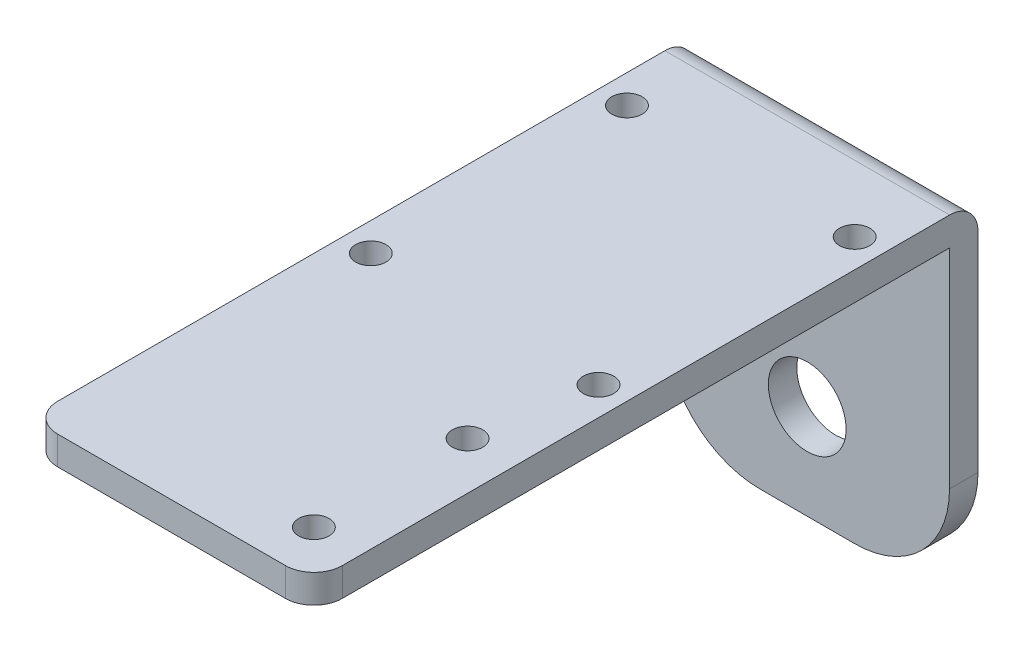
ISO-10303-21;
HEADER;
FILE_DESCRIPTION(('STEP AP214'),'2;1');
FILE_NAME('part.step','',(''),(''),'','','');
FILE_SCHEMA(('AUTOMOTIVE_DESIGN { 1 0 10303 214 1 1 1 1 }'));
ENDSEC;
DATA;
#1=APPLICATION_CONTEXT('core data for automotive mechanical design processes');
#2=APPLICATION_PROTOCOL_DEFINITION('international standard','automotive_design',2000,#1);
#3=PRODUCT_CONTEXT('',#1,'mechanical');
#4=PRODUCT('Part','Part','',(#3));
#5=PRODUCT_RELATED_PRODUCT_CATEGORY('part','',(#4));
#6=PRODUCT_DEFINITION_FORMATION('','',#4);
#7=PRODUCT_DEFINITION_CONTEXT('part definition',#1,'design');
#8=PRODUCT_DEFINITION('design','',#6,#7);
#9=PRODUCT_DEFINITION_SHAPE('','',#8);
#10=(LENGTH_UNIT() NAMED_UNIT(*) SI_UNIT(.MILLI.,.METRE.));
#11=(NAMED_UNIT(*) PLANE_ANGLE_UNIT() SI_UNIT($,.RADIAN.));
#12=(NAMED_UNIT(*) SI_UNIT($,.STERADIAN.) SOLID_ANGLE_UNIT());
#13=UNCERTAINTY_MEASURE_WITH_UNIT(LENGTH_MEASURE(1.E-05),#10,'distance_accuracy_value','');
#14=(GEOMETRIC_REPRESENTATION_CONTEXT(3) GLOBAL_UNCERTAINTY_ASSIGNED_CONTEXT((#13)) GLOBAL_UNIT_ASSIGNED_CONTEXT((#10,
#11,#12)) REPRESENTATION_CONTEXT('',''));
#15=CARTESIAN_POINT('',(0.,0.,0.));
#16=DIRECTION('',(0.,0.,1.));
#17=DIRECTION('',(1.,0.,0.));
#18=AXIS2_PLACEMENT_3D('',#15,#16,#17);
#19=CARTESIAN_POINT('',(0.,0.,0.));
#20=DIRECTION('',(0.,1.,0.));
#21=DIRECTION('',(0.,0.,1.));
#22=AXIS2_PLACEMENT_3D('',#19,#20,#21);
#23=PLANE('',#22);
#24=CARTESIAN_POINT('',(9.99999999999994,0.,13.8));
#25=DIRECTION('',(0.,1.,0.));
#26=DIRECTION('',(0.,0.,1.));
#27=AXIS2_PLACEMENT_3D('',#24,#25,#26);
#28=CIRCLE('',#27,1.6);
#29=CARTESIAN_POINT('',(9.99999999999994,0.,15.4));
#30=VERTEX_POINT('',#29);
#31=EDGE_CURVE('E152',#30,#30,#28,.T.);
#32=ORIENTED_EDGE('',*,*,#31,.T.);
#33=EDGE_LOOP('',(#32));
#34=FACE_BOUND('',#33,.T.);
#35=CARTESIAN_POINT('',(-11.9999999999997,0.,2.));
#36=DIRECTION('',(0.,1.,0.));
#37=DIRECTION('',(0.,0.,1.));
#38=AXIS2_PLACEMENT_3D('',#35,#36,#37);
#39=CIRCLE('',#38,1.6);
#40=CARTESIAN_POINT('',(-11.9999999999997,0.,3.6));
#41=VERTEX_POINT('',#40);
#42=EDGE_CURVE('E158',#41,#41,#39,.T.);
#43=ORIENTED_EDGE('',*,*,#42,.T.);
#44=EDGE_LOOP('',(#43));
#45=FACE_BOUND('',#44,.T.);
#46=CARTESIAN_POINT('',(12.0000000000003,0.,2.));
#47=DIRECTION('',(0.,1.,0.));
#48=DIRECTION('',(0.,0.,1.));
#49=AXIS2_PLACEMENT_3D('',#46,#47,#48);
#50=CIRCLE('',#49,1.6);
#51=CARTESIAN_POINT('',(12.0000000000003,0.,3.6));
#52=VERTEX_POINT('',#51);
#53=EDGE_CURVE('E163',#52,#52,#50,.T.);
#54=ORIENTED_EDGE('',*,*,#53,.T.);
#55=EDGE_LOOP('',(#54));
#56=FACE_BOUND('',#55,.T.);
#57=CARTESIAN_POINT('',(12.,0.,-25.));
#58=DIRECTION('',(0.,1.,0.));
#59=DIRECTION('',(0.,0.,1.));
#60=AXIS2_PLACEMENT_3D('',#57,#58,#59);
#61=CIRCLE('',#60,1.6);
#62=CARTESIAN_POINT('',(12.,0.,-23.4));
#63=VERTEX_POINT('',#62);
#64=EDGE_CURVE('E168',#63,#63,#61,.T.);
#65=ORIENTED_EDGE('',*,*,#64,.T.);
#66=EDGE_LOOP('',(#65));
#67=FACE_BOUND('',#66,.T.);
#68=CARTESIAN_POINT('',(10.,0.,30.));
#69=DIRECTION('',(0.,1.,0.));
#70=DIRECTION('',(0.,0.,1.));
#71=AXIS2_PLACEMENT_3D('',#68,#69,#70);
#72=CIRCLE('',#71,1.6);
#73=CARTESIAN_POINT('',(10.,0.,31.6));
#74=VERTEX_POINT('',#73);
#75=EDGE_CURVE('E177',#74,#74,#72,.T.);
#76=ORIENTED_EDGE('',*,*,#75,.T.);
#77=EDGE_LOOP('',(#76));
#78=FACE_BOUND('',#77,.T.);
#79=CARTESIAN_POINT('',(-12.,0.,-25.));
#80=DIRECTION('',(0.,1.,0.));
#81=DIRECTION('',(0.,0.,1.));
#82=AXIS2_PLACEMENT_3D('',#79,#80,#81);
#83=CIRCLE('',#82,1.6);
#84=CARTESIAN_POINT('',(-12.,0.,-23.4));
#85=VERTEX_POINT('',#84);
#86=EDGE_CURVE('E185',#85,#85,#83,.T.);
#87=ORIENTED_EDGE('',*,*,#86,.T.);
#88=EDGE_LOOP('',(#87));
#89=FACE_BOUND('',#88,.T.);
#90=DIRECTION('',(1.,0.,0.));
#91=VECTOR('',#90,1.);
#92=CARTESIAN_POINT('',(-15.,0.,35.));
#93=LINE('',#92,#91);
#94=CARTESIAN_POINT('',(-12.,0.,35.));
#95=VERTEX_POINT('',#94);
#96=CARTESIAN_POINT('',(12.,0.,35.));
#97=VERTEX_POINT('',#96);
#98=EDGE_CURVE('E139',#95,#97,#93,.T.);
#99=ORIENTED_EDGE('',*,*,#98,.F.);
#100=CARTESIAN_POINT('',(-12.,0.,32.));
#101=DIRECTION('',(0.,1.,0.));
#102=DIRECTION('',(0.,0.,1.));
#103=AXIS2_PLACEMENT_3D('',#100,#101,#102);
#104=CIRCLE('',#103,3.);
#105=CARTESIAN_POINT('',(-15.,0.,32.));
#106=VERTEX_POINT('',#105);
#107=EDGE_CURVE('E140',#95,#106,#104,.F.);
#108=ORIENTED_EDGE('',*,*,#107,.T.);
#109=DIRECTION('',(0.,0.,1.));
#110=VECTOR('',#109,1.);
#111=CARTESIAN_POINT('',(-15.,0.,-35.));
#112=LINE('',#111,#110);
#113=CARTESIAN_POINT('',(-15.,0.,-32.));
#114=VERTEX_POINT('',#113);
#115=EDGE_CURVE('E123',#114,#106,#112,.T.);
#116=ORIENTED_EDGE('',*,*,#115,.F.);
#117=DIRECTION('',(-1.,0.,0.));
#118=VECTOR('',#117,1.);
#119=CARTESIAN_POINT('',(15.,0.,-32.));
#120=LINE('',#119,#118);
#121=CARTESIAN_POINT('',(15.,0.,-32.));
#122=VERTEX_POINT('',#121);
#123=EDGE_CURVE('E137',#122,#114,#120,.T.);
#124=ORIENTED_EDGE('',*,*,#123,.F.);
#125=DIRECTION('',(0.,0.,-1.));
#126=VECTOR('',#125,1.);
#127=CARTESIAN_POINT('',(15.,0.,-35.));
#128=LINE('',#127,#126);
#129=CARTESIAN_POINT('',(15.,0.,32.));
#130=VERTEX_POINT('',#129);
#131=EDGE_CURVE('E136',#130,#122,#128,.T.);
#132=ORIENTED_EDGE('',*,*,#131,.F.);
#133=CARTESIAN_POINT('',(12.,0.,32.));
#134=DIRECTION('',(0.,1.,0.));
#135=DIRECTION('',(0.,0.,1.));
#136=AXIS2_PLACEMENT_3D('',#133,#134,#135);
#137=CIRCLE('',#136,3.);
#138=EDGE_CURVE('E215',#130,#97,#137,.F.);
#139=ORIENTED_EDGE('',*,*,#138,.T.);
#140=EDGE_LOOP('',(#99,#108,#116,#124,#132,#139));
#141=FACE_BOUND('',#140,.T.);
#142=ADVANCED_FACE('F41',(#34,#45,#56,#67,#78,#89,#141),#23,.F.);
#143=CARTESIAN_POINT('',(0.,3.,0.));
#144=DIRECTION('',(0.,1.,0.));
#145=DIRECTION('',(0.,0.,1.));
#146=AXIS2_PLACEMENT_3D('',#143,#144,#145);
#147=PLANE('',#146);
#148=CARTESIAN_POINT('',(-11.9999999999997,3.,2.));
#149=DIRECTION('',(0.,1.,0.));
#150=DIRECTION('',(0.,0.,1.));
#151=AXIS2_PLACEMENT_3D('',#148,#149,#150);
#152=CIRCLE('',#151,1.6);
#153=CARTESIAN_POINT('',(-11.9999999999997,3.,3.6));
#154=VERTEX_POINT('',#153);
#155=EDGE_CURVE('E161',#154,#154,#152,.T.);
#156=ORIENTED_EDGE('',*,*,#155,.F.);
#157=EDGE_LOOP('',(#156));
#158=FACE_BOUND('',#157,.T.);
#159=CARTESIAN_POINT('',(12.,3.,-25.));
#160=DIRECTION('',(0.,1.,0.));
#161=DIRECTION('',(0.,0.,1.));
#162=AXIS2_PLACEMENT_3D('',#159,#160,#161);
#163=CIRCLE('',#162,1.6);
#164=CARTESIAN_POINT('',(12.,3.,-23.4));
#165=VERTEX_POINT('',#164);
#166=EDGE_CURVE('E171',#165,#165,#163,.T.);
#167=ORIENTED_EDGE('',*,*,#166,.F.);
#168=EDGE_LOOP('',(#167));
#169=FACE_BOUND('',#168,.T.);
#170=CARTESIAN_POINT('',(-12.,3.,-25.));
#171=DIRECTION('',(0.,1.,0.));
#172=DIRECTION('',(0.,0.,1.));
#173=AXIS2_PLACEMENT_3D('',#170,#171,#172);
#174=CIRCLE('',#173,1.6);
#175=CARTESIAN_POINT('',(-12.,3.,-23.4));
#176=VERTEX_POINT('',#175);
#177=EDGE_CURVE('E183',#176,#176,#174,.T.);
#178=ORIENTED_EDGE('',*,*,#177,.F.);
#179=EDGE_LOOP('',(#178));
#180=FACE_BOUND('',#179,.T.);
#181=DIRECTION('',(0.,0.,1.));
#182=VECTOR('',#181,1.);
#183=CARTESIAN_POINT('',(-15.,3.,-35.));
#184=LINE('',#183,#182);
#185=CARTESIAN_POINT('',(-15.,3.,-32.));
#186=VERTEX_POINT('',#185);
#187=CARTESIAN_POINT('',(-15.,3.,32.));
#188=VERTEX_POINT('',#187);
#189=EDGE_CURVE('E194',#186,#188,#184,.T.);
#190=ORIENTED_EDGE('',*,*,#189,.T.);
#191=CARTESIAN_POINT('',(-12.,3.,32.));
#192=DIRECTION('',(0.,1.,0.));
#193=DIRECTION('',(0.,0.,1.));
#194=AXIS2_PLACEMENT_3D('',#191,#192,#193);
#195=CIRCLE('',#194,3.);
#196=CARTESIAN_POINT('',(-12.,3.,35.));
#197=VERTEX_POINT('',#196);
#198=EDGE_CURVE('E221',#188,#197,#195,.T.);
#199=ORIENTED_EDGE('',*,*,#198,.T.);
#200=DIRECTION('',(1.,0.,0.));
#201=VECTOR('',#200,1.);
#202=CARTESIAN_POINT('',(-15.,3.,35.));
#203=LINE('',#202,#201);
#204=CARTESIAN_POINT('',(12.,3.,35.));
#205=VERTEX_POINT('',#204);
#206=EDGE_CURVE('E198',#197,#205,#203,.T.);
#207=ORIENTED_EDGE('',*,*,#206,.T.);
#208=CARTESIAN_POINT('',(12.,3.,32.));
#209=DIRECTION('',(0.,1.,0.));
#210=DIRECTION('',(0.,0.,1.));
#211=AXIS2_PLACEMENT_3D('',#208,#209,#210);
#212=CIRCLE('',#211,3.);
#213=CARTESIAN_POINT('',(15.,3.,32.));
#214=VERTEX_POINT('',#213);
#215=EDGE_CURVE('E225',#205,#214,#212,.T.);
#216=ORIENTED_EDGE('',*,*,#215,.T.);
#217=DIRECTION('',(0.,0.,-1.));
#218=VECTOR('',#217,1.);
#219=CARTESIAN_POINT('',(15.,3.,-35.));
#220=LINE('',#219,#218);
#221=CARTESIAN_POINT('',(15.,3.,-32.));
#222=VERTEX_POINT('',#221);
#223=EDGE_CURVE('E189',#214,#222,#220,.T.);
#224=ORIENTED_EDGE('',*,*,#223,.T.);
#225=DIRECTION('',(-1.,0.,0.));
#226=VECTOR('',#225,1.);
#227=CARTESIAN_POINT('',(-15.,3.,-32.));
#228=LINE('',#227,#226);
#229=EDGE_CURVE('E218',#222,#186,#228,.T.);
#230=ORIENTED_EDGE('',*,*,#229,.T.);
#231=EDGE_LOOP('',(#190,#199,#207,#216,#224,#230));
#232=FACE_BOUND('',#231,.T.);
#233=CARTESIAN_POINT('',(10.,3.,30.));
#234=DIRECTION('',(0.,1.,0.));
#235=DIRECTION('',(0.,0.,1.));
#236=AXIS2_PLACEMENT_3D('',#233,#234,#235);
#237=CIRCLE('',#236,1.6);
#238=CARTESIAN_POINT('',(10.,3.,31.6));
#239=VERTEX_POINT('',#238);
#240=EDGE_CURVE('E176',#239,#239,#237,.T.);
#241=ORIENTED_EDGE('',*,*,#240,.F.);
#242=EDGE_LOOP('',(#241));
#243=FACE_BOUND('',#242,.T.);
#244=CARTESIAN_POINT('',(12.0000000000003,3.,2.));
#245=DIRECTION('',(0.,1.,0.));
#246=DIRECTION('',(0.,0.,1.));
#247=AXIS2_PLACEMENT_3D('',#244,#245,#246);
#248=CIRCLE('',#247,1.6);
#249=CARTESIAN_POINT('',(12.0000000000003,3.,3.6));
#250=VERTEX_POINT('',#249);
#251=EDGE_CURVE('E170',#250,#250,#248,.T.);
#252=ORIENTED_EDGE('',*,*,#251,.F.);
#253=EDGE_LOOP('',(#252));
#254=FACE_BOUND('',#253,.T.);
#255=CARTESIAN_POINT('',(9.99999999999994,3.,13.8));
#256=DIRECTION('',(0.,1.,0.));
#257=DIRECTION('',(0.,0.,1.));
#258=AXIS2_PLACEMENT_3D('',#255,#256,#257);
#259=CIRCLE('',#258,1.6);
#260=CARTESIAN_POINT('',(9.99999999999994,3.,15.4));
#261=VERTEX_POINT('',#260);
#262=EDGE_CURVE('E154',#261,#261,#259,.T.);
#263=ORIENTED_EDGE('',*,*,#262,.F.);
#264=EDGE_LOOP('',(#263));
#265=FACE_BOUND('',#264,.T.);
#266=ADVANCED_FACE('F265',(#158,#169,#180,#232,#243,#254,#265),#147,.T.);
#267=CARTESIAN_POINT('',(15.,3.,-35.));
#268=DIRECTION('',(-1.,0.,0.));
#269=DIRECTION('',(0.,0.,1.));
#270=AXIS2_PLACEMENT_3D('',#267,#268,#269);
#271=PLANE('',#270);
#272=DIRECTION('',(0.,1.,0.));
#273=VECTOR('',#272,1.);
#274=CARTESIAN_POINT('',(15.,-32.,-32.));
#275=LINE('',#274,#273);
#276=CARTESIAN_POINT('',(15.,-22.,-32.));
#277=VERTEX_POINT('',#276);
#278=EDGE_CURVE('E129',#277,#122,#275,.T.);
#279=ORIENTED_EDGE('',*,*,#278,.F.);
#280=DIRECTION('',(0.,0.,1.));
#281=VECTOR('',#280,1.);
#282=CARTESIAN_POINT('',(15.,-22.,-35.));
#283=LINE('',#282,#281);
#284=CARTESIAN_POINT('',(15.,-22.,-35.));
#285=VERTEX_POINT('',#284);
#286=EDGE_CURVE('E11',#277,#285,#283,.F.);
#287=ORIENTED_EDGE('',*,*,#286,.T.);
#288=DIRECTION('',(0.,-1.,0.));
#289=VECTOR('',#288,1.);
#290=CARTESIAN_POINT('',(15.,3.,-35.));
#291=LINE('',#290,#289);
#292=CARTESIAN_POINT('',(15.,0.,-35.));
#293=VERTEX_POINT('',#292);
#294=EDGE_CURVE('E204',#293,#285,#291,.T.);
#295=ORIENTED_EDGE('',*,*,#294,.F.);
#296=CARTESIAN_POINT('',(15.,0.,-32.));
#297=DIRECTION('',(-1.,0.,0.));
#298=DIRECTION('',(0.,0.,1.));
#299=AXIS2_PLACEMENT_3D('',#296,#297,#298);
#300=CIRCLE('',#299,3.);
#301=EDGE_CURVE('E228',#293,#222,#300,.F.);
#302=ORIENTED_EDGE('',*,*,#301,.T.);
#303=ORIENTED_EDGE('',*,*,#223,.F.);
#304=DIRECTION('',(0.,-1.,0.));
#305=VECTOR('',#304,1.);
#306=CARTESIAN_POINT('',(15.,3.,32.));
#307=LINE('',#306,#305);
#308=EDGE_CURVE('E226',#214,#130,#307,.T.);
#309=ORIENTED_EDGE('',*,*,#308,.T.);
#310=ORIENTED_EDGE('',*,*,#131,.T.);
#311=EDGE_LOOP('',(#279,#287,#295,#302,#303,#309,#310));
#312=FACE_BOUND('',#311,.T.);
#313=ADVANCED_FACE('F267',(#312),#271,.F.);
#314=CARTESIAN_POINT('',(-15.,3.,-35.));
#315=DIRECTION('',(0.,0.,1.));
#316=DIRECTION('',(1.,0.,0.));
#317=AXIS2_PLACEMENT_3D('',#314,#315,#316);
#318=PLANE('',#317);
#319=CARTESIAN_POINT('',(0.,-22.,-35.));
#320=DIRECTION('',(0.,0.,-1.));
#321=DIRECTION('',(-1.,0.,0.));
#322=AXIS2_PLACEMENT_3D('',#319,#320,#321);
#323=CIRCLE('',#322,4.1);
#324=CARTESIAN_POINT('',(-4.1,-22.,-35.));
#325=VERTEX_POINT('',#324);
#326=EDGE_CURVE('E149',#325,#325,#323,.T.);
#327=ORIENTED_EDGE('',*,*,#326,.F.);
#328=EDGE_LOOP('',(#327));
#329=FACE_BOUND('',#328,.T.);
#330=DIRECTION('',(1.,0.,0.));
#331=VECTOR('',#330,1.);
#332=CARTESIAN_POINT('',(15.,-32.,-35.));
#333=LINE('',#332,#331);
#334=CARTESIAN_POINT('',(-5.,-32.,-35.));
#335=VERTEX_POINT('',#334);
#336=CARTESIAN_POINT('',(4.99999999999999,-32.,-35.));
#337=VERTEX_POINT('',#336);
#338=EDGE_CURVE('E128',#335,#337,#333,.T.);
#339=ORIENTED_EDGE('',*,*,#338,.F.);
#340=CARTESIAN_POINT('',(-5.00000000000001,-22.,-35.));
#341=DIRECTION('',(0.,0.,1.));
#342=DIRECTION('',(1.,0.,0.));
#343=AXIS2_PLACEMENT_3D('',#340,#341,#342);
#344=CIRCLE('',#343,10.);
#345=CARTESIAN_POINT('',(-15.,-22.,-35.));
#346=VERTEX_POINT('',#345);
#347=EDGE_CURVE('E243',#335,#346,#344,.F.);
#348=ORIENTED_EDGE('',*,*,#347,.T.);
#349=DIRECTION('',(0.,-1.,0.));
#350=VECTOR('',#349,1.);
#351=CARTESIAN_POINT('',(-15.,3.,-35.));
#352=LINE('',#351,#350);
#353=CARTESIAN_POINT('',(-15.,0.,-35.));
#354=VERTEX_POINT('',#353);
#355=EDGE_CURVE('E200',#354,#346,#352,.T.);
#356=ORIENTED_EDGE('',*,*,#355,.F.);
#357=DIRECTION('',(-1.,0.,0.));
#358=VECTOR('',#357,1.);
#359=CARTESIAN_POINT('',(15.,0.,-35.));
#360=LINE('',#359,#358);
#361=EDGE_CURVE('E232',#354,#293,#360,.F.);
#362=ORIENTED_EDGE('',*,*,#361,.T.);
#363=ORIENTED_EDGE('',*,*,#294,.T.);
#364=CARTESIAN_POINT('',(4.99999999999999,-22.,-35.));
#365=DIRECTION('',(0.,0.,1.));
#366=DIRECTION('',(1.,0.,0.));
#367=AXIS2_PLACEMENT_3D('',#364,#365,#366);
#368=CIRCLE('',#367,10.);
#369=EDGE_CURVE('E239',#285,#337,#368,.F.);
#370=ORIENTED_EDGE('',*,*,#369,.T.);
#371=EDGE_LOOP('',(#339,#348,#356,#362,#363,#370));
#372=FACE_BOUND('',#371,.T.);
#373=ADVANCED_FACE('F255',(#329,#372),#318,.F.);
#374=CARTESIAN_POINT('',(-15.,3.,-35.));
#375=DIRECTION('',(1.,0.,0.));
#376=DIRECTION('',(0.,0.,-1.));
#377=AXIS2_PLACEMENT_3D('',#374,#375,#376);
#378=PLANE('',#377);
#379=ORIENTED_EDGE('',*,*,#355,.T.);
#380=DIRECTION('',(0.,0.,-1.));
#381=VECTOR('',#380,1.);
#382=CARTESIAN_POINT('',(-15.,-22.,-32.));
#383=LINE('',#382,#381);
#384=CARTESIAN_POINT('',(-15.,-22.,-32.));
#385=VERTEX_POINT('',#384);
#386=EDGE_CURVE('E62',#346,#385,#383,.F.);
#387=ORIENTED_EDGE('',*,*,#386,.T.);
#388=DIRECTION('',(0.,1.,0.));
#389=VECTOR('',#388,1.);
#390=CARTESIAN_POINT('',(-15.,-32.,-32.));
#391=LINE('',#390,#389);
#392=EDGE_CURVE('E125',#385,#114,#391,.T.);
#393=ORIENTED_EDGE('',*,*,#392,.T.);
#394=ORIENTED_EDGE('',*,*,#115,.T.);
#395=DIRECTION('',(0.,-1.,0.));
#396=VECTOR('',#395,1.);
#397=CARTESIAN_POINT('',(-15.,3.,32.));
#398=LINE('',#397,#396);
#399=EDGE_CURVE('E220',#106,#188,#398,.F.);
#400=ORIENTED_EDGE('',*,*,#399,.T.);
#401=ORIENTED_EDGE('',*,*,#189,.F.);
#402=CARTESIAN_POINT('',(-15.,0.,-32.));
#403=DIRECTION('',(1.,0.,0.));
#404=DIRECTION('',(0.,0.,-1.));
#405=AXIS2_PLACEMENT_3D('',#402,#403,#404);
#406=CIRCLE('',#405,3.);
#407=EDGE_CURVE('E214',#186,#354,#406,.F.);
#408=ORIENTED_EDGE('',*,*,#407,.T.);
#409=EDGE_LOOP('',(#379,#387,#393,#394,#400,#401,#408));
#410=FACE_BOUND('',#409,.T.);
#411=ADVANCED_FACE('F121',(#410),#378,.F.);
#412=CARTESIAN_POINT('',(-15.,3.,35.));
#413=DIRECTION('',(0.,0.,-1.));
#414=DIRECTION('',(-1.,0.,0.));
#415=AXIS2_PLACEMENT_3D('',#412,#413,#414);
#416=PLANE('',#415);
#417=ORIENTED_EDGE('',*,*,#206,.F.);
#418=DIRECTION('',(0.,-1.,0.));
#419=VECTOR('',#418,1.);
#420=CARTESIAN_POINT('',(-12.,3.,35.));
#421=LINE('',#420,#419);
#422=EDGE_CURVE('E207',#197,#95,#421,.T.);
#423=ORIENTED_EDGE('',*,*,#422,.T.);
#424=ORIENTED_EDGE('',*,*,#98,.T.);
#425=DIRECTION('',(0.,-1.,0.));
#426=VECTOR('',#425,1.);
#427=CARTESIAN_POINT('',(12.,3.,35.));
#428=LINE('',#427,#426);
#429=EDGE_CURVE('E210',#97,#205,#428,.F.);
#430=ORIENTED_EDGE('',*,*,#429,.T.);
#431=EDGE_LOOP('',(#417,#423,#424,#430));
#432=FACE_BOUND('',#431,.T.);
#433=ADVANCED_FACE('F277',(#432),#416,.F.);
#434=CARTESIAN_POINT('',(-12.,3.,-25.));
#435=DIRECTION('',(0.,-1.,0.));
#436=DIRECTION('',(0.,0.,-1.));
#437=AXIS2_PLACEMENT_3D('',#434,#435,#436);
#438=CYLINDRICAL_SURFACE('',#437,1.6);
#439=ORIENTED_EDGE('',*,*,#177,.T.);
#440=EDGE_LOOP('',(#439));
#441=FACE_BOUND('',#440,.T.);
#442=ORIENTED_EDGE('',*,*,#86,.F.);
#443=EDGE_LOOP('',(#442));
#444=FACE_BOUND('',#443,.T.);
#445=ADVANCED_FACE('F301',(#441,#444),#438,.F.);
#446=CARTESIAN_POINT('',(10.,3.,30.));
#447=DIRECTION('',(0.,-1.,0.));
#448=DIRECTION('',(0.,0.,-1.));
#449=AXIS2_PLACEMENT_3D('',#446,#447,#448);
#450=CYLINDRICAL_SURFACE('',#449,1.6);
#451=ORIENTED_EDGE('',*,*,#240,.T.);
#452=EDGE_LOOP('',(#451));
#453=FACE_BOUND('',#452,.T.);
#454=ORIENTED_EDGE('',*,*,#75,.F.);
#455=EDGE_LOOP('',(#454));
#456=FACE_BOUND('',#455,.T.);
#457=ADVANCED_FACE('F418',(#453,#456),#450,.F.);
#458=CARTESIAN_POINT('',(12.,3.,-25.));
#459=DIRECTION('',(0.,-1.,0.));
#460=DIRECTION('',(0.,0.,-1.));
#461=AXIS2_PLACEMENT_3D('',#458,#459,#460);
#462=CYLINDRICAL_SURFACE('',#461,1.6);
#463=ORIENTED_EDGE('',*,*,#166,.T.);
#464=EDGE_LOOP('',(#463));
#465=FACE_BOUND('',#464,.T.);
#466=ORIENTED_EDGE('',*,*,#64,.F.);
#467=EDGE_LOOP('',(#466));
#468=FACE_BOUND('',#467,.T.);
#469=ADVANCED_FACE('F410',(#465,#468),#462,.F.);
#470=CARTESIAN_POINT('',(12.0000000000003,3.,2.));
#471=DIRECTION('',(0.,-1.,0.));
#472=DIRECTION('',(0.,0.,-1.));
#473=AXIS2_PLACEMENT_3D('',#470,#471,#472);
#474=CYLINDRICAL_SURFACE('',#473,1.6);
#475=ORIENTED_EDGE('',*,*,#251,.T.);
#476=EDGE_LOOP('',(#475));
#477=FACE_BOUND('',#476,.T.);
#478=ORIENTED_EDGE('',*,*,#53,.F.);
#479=EDGE_LOOP('',(#478));
#480=FACE_BOUND('',#479,.T.);
#481=ADVANCED_FACE('F399',(#477,#480),#474,.F.);
#482=CARTESIAN_POINT('',(-11.9999999999997,3.,2.));
#483=DIRECTION('',(0.,-1.,0.));
#484=DIRECTION('',(0.,0.,-1.));
#485=AXIS2_PLACEMENT_3D('',#482,#483,#484);
#486=CYLINDRICAL_SURFACE('',#485,1.6);
#487=ORIENTED_EDGE('',*,*,#155,.T.);
#488=EDGE_LOOP('',(#487));
#489=FACE_BOUND('',#488,.T.);
#490=ORIENTED_EDGE('',*,*,#42,.F.);
#491=EDGE_LOOP('',(#490));
#492=FACE_BOUND('',#491,.T.);
#493=ADVANCED_FACE('F386',(#489,#492),#486,.F.);
#494=CARTESIAN_POINT('',(9.99999999999994,3.,13.8));
#495=DIRECTION('',(0.,-1.,0.));
#496=DIRECTION('',(0.,0.,-1.));
#497=AXIS2_PLACEMENT_3D('',#494,#495,#496);
#498=CYLINDRICAL_SURFACE('',#497,1.6);
#499=ORIENTED_EDGE('',*,*,#262,.T.);
#500=EDGE_LOOP('',(#499));
#501=FACE_BOUND('',#500,.T.);
#502=ORIENTED_EDGE('',*,*,#31,.F.);
#503=EDGE_LOOP('',(#502));
#504=FACE_BOUND('',#503,.T.);
#505=ADVANCED_FACE('F334',(#501,#504),#498,.F.);
#506=CARTESIAN_POINT('',(15.,-32.,-32.));
#507=DIRECTION('',(0.,0.,-1.));
#508=DIRECTION('',(-1.,0.,0.));
#509=AXIS2_PLACEMENT_3D('',#506,#507,#508);
#510=PLANE('',#509);
#511=CARTESIAN_POINT('',(0.,-22.,-32.));
#512=DIRECTION('',(0.,0.,-1.));
#513=DIRECTION('',(-1.,0.,0.));
#514=AXIS2_PLACEMENT_3D('',#511,#512,#513);
#515=CIRCLE('',#514,4.1);
#516=CARTESIAN_POINT('',(-4.1,-22.,-32.));
#517=VERTEX_POINT('',#516);
#518=EDGE_CURVE('E145',#517,#517,#515,.F.);
#519=ORIENTED_EDGE('',*,*,#518,.F.);
#520=EDGE_LOOP('',(#519));
#521=FACE_BOUND('',#520,.T.);
#522=ORIENTED_EDGE('',*,*,#392,.F.);
#523=CARTESIAN_POINT('',(-5.00000000000001,-22.,-32.));
#524=DIRECTION('',(0.,0.,-1.));
#525=DIRECTION('',(-1.,0.,0.));
#526=AXIS2_PLACEMENT_3D('',#523,#524,#525);
#527=CIRCLE('',#526,10.);
#528=CARTESIAN_POINT('',(-5.,-32.,-32.));
#529=VERTEX_POINT('',#528);
#530=EDGE_CURVE('E47',#385,#529,#527,.F.);
#531=ORIENTED_EDGE('',*,*,#530,.T.);
#532=DIRECTION('',(-1.,0.,0.));
#533=VECTOR('',#532,1.);
#534=CARTESIAN_POINT('',(15.,-32.,-32.));
#535=LINE('',#534,#533);
#536=CARTESIAN_POINT('',(4.99999999999999,-32.,-32.));
#537=VERTEX_POINT('',#536);
#538=EDGE_CURVE('E141',#537,#529,#535,.T.);
#539=ORIENTED_EDGE('',*,*,#538,.F.);
#540=CARTESIAN_POINT('',(4.99999999999999,-22.,-32.));
#541=DIRECTION('',(0.,0.,-1.));
#542=DIRECTION('',(-1.,0.,0.));
#543=AXIS2_PLACEMENT_3D('',#540,#541,#542);
#544=CIRCLE('',#543,10.);
#545=EDGE_CURVE('E57',#537,#277,#544,.F.);
#546=ORIENTED_EDGE('',*,*,#545,.T.);
#547=ORIENTED_EDGE('',*,*,#278,.T.);
#548=ORIENTED_EDGE('',*,*,#123,.T.);
#549=EDGE_LOOP('',(#522,#531,#539,#546,#547,#548));
#550=FACE_BOUND('',#549,.T.);
#551=ADVANCED_FACE('F143',(#521,#550),#510,.F.);
#552=CARTESIAN_POINT('',(0.,-32.,0.));
#553=DIRECTION('',(0.,-1.,0.));
#554=DIRECTION('',(0.,0.,-1.));
#555=AXIS2_PLACEMENT_3D('',#552,#553,#554);
#556=PLANE('',#555);
#557=ORIENTED_EDGE('',*,*,#538,.T.);
#558=DIRECTION('',(0.,0.,-1.));
#559=VECTOR('',#558,1.);
#560=CARTESIAN_POINT('',(-5.00000000000001,-32.,-35.));
#561=LINE('',#560,#559);
#562=EDGE_CURVE('E237',#529,#335,#561,.T.);
#563=ORIENTED_EDGE('',*,*,#562,.T.);
#564=ORIENTED_EDGE('',*,*,#338,.T.);
#565=DIRECTION('',(0.,0.,1.));
#566=VECTOR('',#565,1.);
#567=CARTESIAN_POINT('',(4.99999999999999,-32.,-32.));
#568=LINE('',#567,#566);
#569=EDGE_CURVE('E234',#337,#537,#568,.T.);
#570=ORIENTED_EDGE('',*,*,#569,.T.);
#571=EDGE_LOOP('',(#557,#563,#564,#570));
#572=FACE_BOUND('',#571,.T.);
#573=ADVANCED_FACE('F250',(#572),#556,.T.);
#574=CARTESIAN_POINT('',(0.,-22.,35.001));
#575=DIRECTION('',(0.,0.,-1.));
#576=DIRECTION('',(-1.,0.,0.));
#577=AXIS2_PLACEMENT_3D('',#574,#575,#576);
#578=CYLINDRICAL_SURFACE('',#577,4.1);
#579=ORIENTED_EDGE('',*,*,#326,.T.);
#580=EDGE_LOOP('',(#579));
#581=FACE_BOUND('',#580,.T.);
#582=ORIENTED_EDGE('',*,*,#518,.T.);
#583=EDGE_LOOP('',(#582));
#584=FACE_BOUND('',#583,.T.);
#585=ADVANCED_FACE('F283',(#581,#584),#578,.F.);
#586=CARTESIAN_POINT('',(-12.,3.,32.));
#587=DIRECTION('',(0.,-1.,0.));
#588=DIRECTION('',(0.,0.,-1.));
#589=AXIS2_PLACEMENT_3D('',#586,#587,#588);
#590=CYLINDRICAL_SURFACE('',#589,3.);
#591=ORIENTED_EDGE('',*,*,#198,.F.);
#592=ORIENTED_EDGE('',*,*,#399,.F.);
#593=ORIENTED_EDGE('',*,*,#107,.F.);
#594=ORIENTED_EDGE('',*,*,#422,.F.);
#595=EDGE_LOOP('',(#591,#592,#593,#594));
#596=FACE_BOUND('',#595,.T.);
#597=ADVANCED_FACE('F276',(#596),#590,.T.);
#598=CARTESIAN_POINT('',(12.,3.,32.));
#599=DIRECTION('',(0.,-1.,0.));
#600=DIRECTION('',(0.,0.,-1.));
#601=AXIS2_PLACEMENT_3D('',#598,#599,#600);
#602=CYLINDRICAL_SURFACE('',#601,3.);
#603=ORIENTED_EDGE('',*,*,#215,.F.);
#604=ORIENTED_EDGE('',*,*,#429,.F.);
#605=ORIENTED_EDGE('',*,*,#138,.F.);
#606=ORIENTED_EDGE('',*,*,#308,.F.);
#607=EDGE_LOOP('',(#603,#604,#605,#606));
#608=FACE_BOUND('',#607,.T.);
#609=ADVANCED_FACE('F275',(#608),#602,.T.);
#610=CARTESIAN_POINT('',(0.,0.,-32.));
#611=DIRECTION('',(1.,0.,0.));
#612=DIRECTION('',(0.,0.,-1.));
#613=AXIS2_PLACEMENT_3D('',#610,#611,#612);
#614=CYLINDRICAL_SURFACE('',#613,3.);
#615=ORIENTED_EDGE('',*,*,#301,.F.);
#616=ORIENTED_EDGE('',*,*,#361,.F.);
#617=ORIENTED_EDGE('',*,*,#407,.F.);
#618=ORIENTED_EDGE('',*,*,#229,.F.);
#619=EDGE_LOOP('',(#615,#616,#617,#618));
#620=FACE_BOUND('',#619,.T.);
#621=ADVANCED_FACE('F257',(#620),#614,.T.);
#622=CARTESIAN_POINT('',(-5.,-22.,0.));
#623=DIRECTION('',(0.,0.,1.));
#624=DIRECTION('',(1.,0.,0.));
#625=AXIS2_PLACEMENT_3D('',#622,#623,#624);
#626=CYLINDRICAL_SURFACE('',#625,10.);
#627=ORIENTED_EDGE('',*,*,#530,.F.);
#628=ORIENTED_EDGE('',*,*,#386,.F.);
#629=ORIENTED_EDGE('',*,*,#347,.F.);
#630=ORIENTED_EDGE('',*,*,#562,.F.);
#631=EDGE_LOOP('',(#627,#628,#629,#630));
#632=FACE_BOUND('',#631,.T.);
#633=ADVANCED_FACE('F253',(#632),#626,.T.);
#634=CARTESIAN_POINT('',(5.,-22.,0.));
#635=DIRECTION('',(0.,0.,-1.));
#636=DIRECTION('',(-1.,0.,0.));
#637=AXIS2_PLACEMENT_3D('',#634,#635,#636);
#638=CYLINDRICAL_SURFACE('',#637,10.);
#639=ORIENTED_EDGE('',*,*,#369,.F.);
#640=ORIENTED_EDGE('',*,*,#286,.F.);
#641=ORIENTED_EDGE('',*,*,#545,.F.);
#642=ORIENTED_EDGE('',*,*,#569,.F.);
#643=EDGE_LOOP('',(#639,#640,#641,#642));
#644=FACE_BOUND('',#643,.T.);
#645=ADVANCED_FACE('F43',(#644),#638,.T.);
#646=CLOSED_SHELL('',(#142,#266,#313,#373,#411,#433,#445,#457,#469,#481,#493,#505,#551,#573,
#585,#597,#609,#621,#633,#645));
#647=MANIFOLD_SOLID_BREP('B2',#646);
#648=ADVANCED_BREP_SHAPE_REPRESENTATION('',(#18,#647),#14);
#649=SHAPE_DEFINITION_REPRESENTATION(#9,#648);
ENDSEC;
END-ISO-10303-21;
